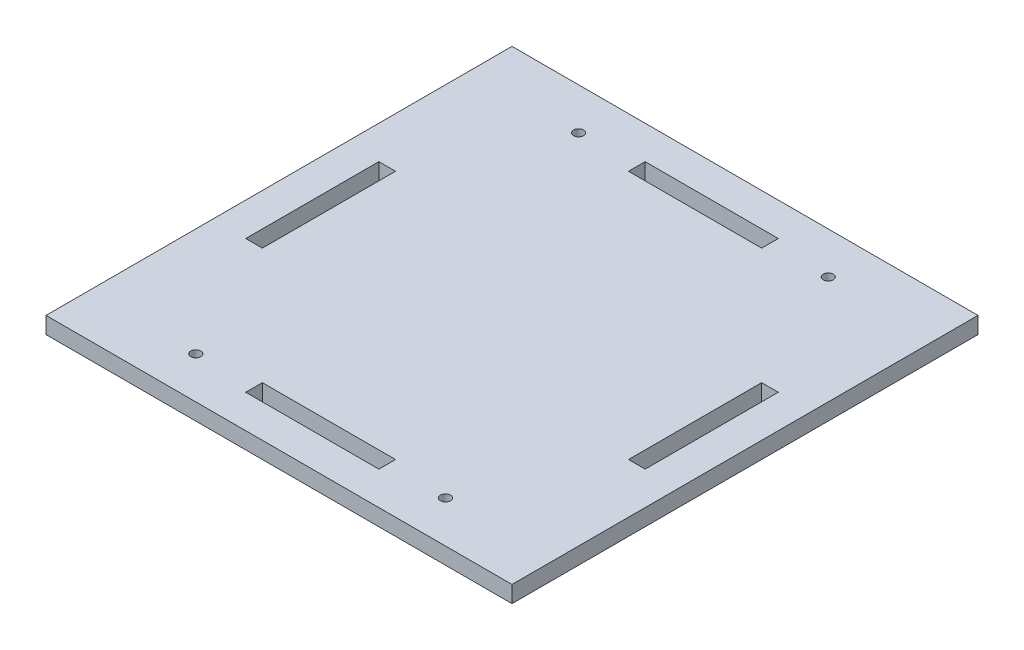
ISO-10303-21;
HEADER;
FILE_DESCRIPTION(('STEP AP214'),'2;1');
FILE_NAME('part.step','',(''),(''),'','','');
FILE_SCHEMA(('AUTOMOTIVE_DESIGN { 1 0 10303 214 1 1 1 1 }'));
ENDSEC;
DATA;
#1=APPLICATION_CONTEXT('core data for automotive mechanical design processes');
#2=APPLICATION_PROTOCOL_DEFINITION('international standard','automotive_design',2000,#1);
#3=PRODUCT_CONTEXT('',#1,'mechanical');
#4=PRODUCT('Part','Part','',(#3));
#5=PRODUCT_RELATED_PRODUCT_CATEGORY('part','',(#4));
#6=PRODUCT_DEFINITION_FORMATION('','',#4);
#7=PRODUCT_DEFINITION_CONTEXT('part definition',#1,'design');
#8=PRODUCT_DEFINITION('design','',#6,#7);
#9=PRODUCT_DEFINITION_SHAPE('','',#8);
#10=(LENGTH_UNIT() NAMED_UNIT(*) SI_UNIT(.MILLI.,.METRE.));
#11=(NAMED_UNIT(*) PLANE_ANGLE_UNIT() SI_UNIT($,.RADIAN.));
#12=(NAMED_UNIT(*) SI_UNIT($,.STERADIAN.) SOLID_ANGLE_UNIT());
#13=UNCERTAINTY_MEASURE_WITH_UNIT(LENGTH_MEASURE(1.E-05),#10,'distance_accuracy_value','');
#14=(GEOMETRIC_REPRESENTATION_CONTEXT(3) GLOBAL_UNCERTAINTY_ASSIGNED_CONTEXT((#13)) GLOBAL_UNIT_ASSIGNED_CONTEXT((#10,
#11,#12)) REPRESENTATION_CONTEXT('',''));
#15=CARTESIAN_POINT('',(0.,0.,0.));
#16=DIRECTION('',(0.,0.,1.));
#17=DIRECTION('',(1.,0.,0.));
#18=AXIS2_PLACEMENT_3D('',#15,#16,#17);
#19=CARTESIAN_POINT('',(0.,5.,0.));
#20=DIRECTION('',(0.,1.,0.));
#21=DIRECTION('',(0.,0.,1.));
#22=AXIS2_PLACEMENT_3D('',#19,#20,#21);
#23=PLANE('',#22);
#24=CARTESIAN_POINT('',(32.5,5.,-12.5));
#25=DIRECTION('',(0.,-1.,0.));
#26=DIRECTION('',(0.,0.,-1.));
#27=AXIS2_PLACEMENT_3D('',#24,#25,#26);
#28=CIRCLE('',#27,1.5);
#29=CARTESIAN_POINT('',(32.5,5.,-14.));
#30=VERTEX_POINT('',#29);
#31=EDGE_CURVE('E633',#30,#30,#28,.T.);
#32=ORIENTED_EDGE('',*,*,#31,.T.);
#33=EDGE_LOOP('',(#32));
#34=FACE_BOUND('',#33,.T.);
#35=DIRECTION('',(-1.,0.,0.));
#36=VECTOR('',#35,1.);
#37=CARTESIAN_POINT('',(130.,5.,-90.));
#38=LINE('',#37,#36);
#39=CARTESIAN_POINT('',(130.,5.,-90.));
#40=VERTEX_POINT('',#39);
#41=CARTESIAN_POINT('',(125.,5.,-90.));
#42=VERTEX_POINT('',#41);
#43=EDGE_CURVE('E338',#40,#42,#38,.T.);
#44=ORIENTED_EDGE('',*,*,#43,.F.);
#45=DIRECTION('',(0.,0.,-1.));
#46=VECTOR('',#45,1.);
#47=CARTESIAN_POINT('',(130.,5.,-50.));
#48=LINE('',#47,#46);
#49=CARTESIAN_POINT('',(130.,5.,-50.));
#50=VERTEX_POINT('',#49);
#51=EDGE_CURVE('E330',#50,#40,#48,.T.);
#52=ORIENTED_EDGE('',*,*,#51,.F.);
#53=DIRECTION('',(1.,0.,0.));
#54=VECTOR('',#53,1.);
#55=CARTESIAN_POINT('',(125.,5.,-50.));
#56=LINE('',#55,#54);
#57=CARTESIAN_POINT('',(125.,5.,-50.));
#58=VERTEX_POINT('',#57);
#59=EDGE_CURVE('E353',#58,#50,#56,.T.);
#60=ORIENTED_EDGE('',*,*,#59,.F.);
#61=DIRECTION('',(0.,0.,1.));
#62=VECTOR('',#61,1.);
#63=CARTESIAN_POINT('',(125.,5.,-90.));
#64=LINE('',#63,#62);
#65=EDGE_CURVE('E351',#42,#58,#64,.T.);
#66=ORIENTED_EDGE('',*,*,#65,.F.);
#67=EDGE_LOOP('',(#44,#52,#60,#66));
#68=FACE_BOUND('',#67,.T.);
#69=CARTESIAN_POINT('',(32.5,5.,-127.5));
#70=DIRECTION('',(0.,1.,0.));
#71=DIRECTION('',(0.,0.,1.));
#72=AXIS2_PLACEMENT_3D('',#69,#70,#71);
#73=CIRCLE('',#72,1.5);
#74=CARTESIAN_POINT('',(32.5,5.,-126.));
#75=VERTEX_POINT('',#74);
#76=EDGE_CURVE('E375',#75,#75,#73,.T.);
#77=ORIENTED_EDGE('',*,*,#76,.F.);
#78=EDGE_LOOP('',(#77));
#79=FACE_BOUND('',#78,.T.);
#80=DIRECTION('',(0.,0.,1.));
#81=VECTOR('',#80,1.);
#82=CARTESIAN_POINT('',(90.,5.,-130.));
#83=LINE('',#82,#81);
#84=CARTESIAN_POINT('',(90.,5.,-130.));
#85=VERTEX_POINT('',#84);
#86=CARTESIAN_POINT('',(90.,5.,-125.));
#87=VERTEX_POINT('',#86);
#88=EDGE_CURVE('E381',#85,#87,#83,.T.);
#89=ORIENTED_EDGE('',*,*,#88,.T.);
#90=DIRECTION('',(-1.,0.,0.));
#91=VECTOR('',#90,1.);
#92=CARTESIAN_POINT('',(90.,5.,-125.));
#93=LINE('',#92,#91);
#94=CARTESIAN_POINT('',(50.,5.,-125.));
#95=VERTEX_POINT('',#94);
#96=EDGE_CURVE('E384',#87,#95,#93,.T.);
#97=ORIENTED_EDGE('',*,*,#96,.T.);
#98=DIRECTION('',(0.,0.,-1.));
#99=VECTOR('',#98,1.);
#100=CARTESIAN_POINT('',(50.,5.,-125.));
#101=LINE('',#100,#99);
#102=CARTESIAN_POINT('',(50.,5.,-130.));
#103=VERTEX_POINT('',#102);
#104=EDGE_CURVE('E388',#95,#103,#101,.T.);
#105=ORIENTED_EDGE('',*,*,#104,.T.);
#106=DIRECTION('',(1.,0.,0.));
#107=VECTOR('',#106,1.);
#108=CARTESIAN_POINT('',(50.,5.,-130.));
#109=LINE('',#108,#107);
#110=EDGE_CURVE('E391',#103,#85,#109,.T.);
#111=ORIENTED_EDGE('',*,*,#110,.T.);
#112=EDGE_LOOP('',(#89,#97,#105,#111));
#113=FACE_BOUND('',#112,.T.);
#114=DIRECTION('',(1.,0.,0.));
#115=VECTOR('',#114,1.);
#116=CARTESIAN_POINT('',(10.,5.,-90.));
#117=LINE('',#116,#115);
#118=CARTESIAN_POINT('',(10.,5.,-90.));
#119=VERTEX_POINT('',#118);
#120=CARTESIAN_POINT('',(15.,5.,-90.));
#121=VERTEX_POINT('',#120);
#122=EDGE_CURVE('E444',#119,#121,#117,.T.);
#123=ORIENTED_EDGE('',*,*,#122,.T.);
#124=DIRECTION('',(0.,0.,1.));
#125=VECTOR('',#124,1.);
#126=CARTESIAN_POINT('',(15.,5.,-90.));
#127=LINE('',#126,#125);
#128=CARTESIAN_POINT('',(15.,5.,-50.));
#129=VERTEX_POINT('',#128);
#130=EDGE_CURVE('E447',#121,#129,#127,.T.);
#131=ORIENTED_EDGE('',*,*,#130,.T.);
#132=DIRECTION('',(-1.,0.,0.));
#133=VECTOR('',#132,1.);
#134=CARTESIAN_POINT('',(15.,5.,-50.));
#135=LINE('',#134,#133);
#136=CARTESIAN_POINT('',(10.,5.,-50.));
#137=VERTEX_POINT('',#136);
#138=EDGE_CURVE('E451',#129,#137,#135,.T.);
#139=ORIENTED_EDGE('',*,*,#138,.T.);
#140=DIRECTION('',(0.,0.,-1.));
#141=VECTOR('',#140,1.);
#142=CARTESIAN_POINT('',(10.,5.,-50.));
#143=LINE('',#142,#141);
#144=EDGE_CURVE('E454',#137,#119,#143,.T.);
#145=ORIENTED_EDGE('',*,*,#144,.T.);
#146=EDGE_LOOP('',(#123,#131,#139,#145));
#147=FACE_BOUND('',#146,.T.);
#148=DIRECTION('',(0.,0.,1.));
#149=VECTOR('',#148,1.);
#150=CARTESIAN_POINT('',(0.,5.,-140.));
#151=LINE('',#150,#149);
#152=CARTESIAN_POINT('',(0.,5.,-140.));
#153=VERTEX_POINT('',#152);
#154=CARTESIAN_POINT('',(0.,5.,0.));
#155=VERTEX_POINT('',#154);
#156=EDGE_CURVE('E476',#153,#155,#151,.T.);
#157=ORIENTED_EDGE('',*,*,#156,.T.);
#158=DIRECTION('',(1.,0.,0.));
#159=VECTOR('',#158,1.);
#160=CARTESIAN_POINT('',(0.,5.,0.));
#161=LINE('',#160,#159);
#162=CARTESIAN_POINT('',(140.,5.,0.));
#163=VERTEX_POINT('',#162);
#164=EDGE_CURVE('E479',#155,#163,#161,.T.);
#165=ORIENTED_EDGE('',*,*,#164,.T.);
#166=DIRECTION('',(0.,0.,-1.));
#167=VECTOR('',#166,1.);
#168=CARTESIAN_POINT('',(140.,5.,0.));
#169=LINE('',#168,#167);
#170=CARTESIAN_POINT('',(140.,5.,-140.));
#171=VERTEX_POINT('',#170);
#172=EDGE_CURVE('E482',#163,#171,#169,.T.);
#173=ORIENTED_EDGE('',*,*,#172,.T.);
#174=DIRECTION('',(-1.,0.,0.));
#175=VECTOR('',#174,1.);
#176=CARTESIAN_POINT('',(140.,5.,-140.));
#177=LINE('',#176,#175);
#178=EDGE_CURVE('E484',#171,#153,#177,.T.);
#179=ORIENTED_EDGE('',*,*,#178,.T.);
#180=EDGE_LOOP('',(#157,#165,#173,#179));
#181=FACE_BOUND('',#180,.T.);
#182=DIRECTION('',(-1.,0.,0.));
#183=VECTOR('',#182,1.);
#184=CARTESIAN_POINT('',(90.,5.,-15.));
#185=LINE('',#184,#183);
#186=CARTESIAN_POINT('',(90.,5.,-15.));
#187=VERTEX_POINT('',#186);
#188=CARTESIAN_POINT('',(50.,5.,-15.));
#189=VERTEX_POINT('',#188);
#190=EDGE_CURVE('E415',#187,#189,#185,.T.);
#191=ORIENTED_EDGE('',*,*,#190,.F.);
#192=DIRECTION('',(0.,0.,-1.));
#193=VECTOR('',#192,1.);
#194=CARTESIAN_POINT('',(90.,5.,-10.));
#195=LINE('',#194,#193);
#196=CARTESIAN_POINT('',(90.,5.,-10.));
#197=VERTEX_POINT('',#196);
#198=EDGE_CURVE('E413',#197,#187,#195,.T.);
#199=ORIENTED_EDGE('',*,*,#198,.F.);
#200=DIRECTION('',(1.,0.,0.));
#201=VECTOR('',#200,1.);
#202=CARTESIAN_POINT('',(50.,5.,-10.));
#203=LINE('',#202,#201);
#204=CARTESIAN_POINT('',(50.,5.,-10.));
#205=VERTEX_POINT('',#204);
#206=EDGE_CURVE('E421',#205,#197,#203,.T.);
#207=ORIENTED_EDGE('',*,*,#206,.F.);
#208=DIRECTION('',(0.,0.,1.));
#209=VECTOR('',#208,1.);
#210=CARTESIAN_POINT('',(50.,5.,-15.));
#211=LINE('',#210,#209);
#212=EDGE_CURVE('E418',#189,#205,#211,.T.);
#213=ORIENTED_EDGE('',*,*,#212,.F.);
#214=EDGE_LOOP('',(#191,#199,#207,#213));
#215=FACE_BOUND('',#214,.T.);
#216=CARTESIAN_POINT('',(107.5,5.,-127.5));
#217=DIRECTION('',(0.,-1.,0.));
#218=DIRECTION('',(0.,0.,-1.));
#219=AXIS2_PLACEMENT_3D('',#216,#217,#218);
#220=CIRCLE('',#219,1.5);
#221=CARTESIAN_POINT('',(107.5,5.,-129.));
#222=VERTEX_POINT('',#221);
#223=EDGE_CURVE('E369',#222,#222,#220,.T.);
#224=ORIENTED_EDGE('',*,*,#223,.T.);
#225=EDGE_LOOP('',(#224));
#226=FACE_BOUND('',#225,.T.);
#227=CARTESIAN_POINT('',(107.5,5.,-12.5));
#228=DIRECTION('',(0.,1.,0.));
#229=DIRECTION('',(0.,0.,1.));
#230=AXIS2_PLACEMENT_3D('',#227,#228,#229);
#231=CIRCLE('',#230,1.5);
#232=CARTESIAN_POINT('',(107.5,5.,-11.));
#233=VERTEX_POINT('',#232);
#234=EDGE_CURVE('E359',#233,#233,#231,.T.);
#235=ORIENTED_EDGE('',*,*,#234,.F.);
#236=EDGE_LOOP('',(#235));
#237=FACE_BOUND('',#236,.T.);
#238=ADVANCED_FACE('F193',(#34,#68,#79,#113,#147,#181,#215,#226,#237),#23,.T.);
#239=CARTESIAN_POINT('',(0.,0.,0.));
#240=DIRECTION('',(0.,1.,0.));
#241=DIRECTION('',(0.,0.,1.));
#242=AXIS2_PLACEMENT_3D('',#239,#240,#241);
#243=PLANE('',#242);
#244=CARTESIAN_POINT('',(32.5,0.,-12.5));
#245=DIRECTION('',(0.,-1.,0.));
#246=DIRECTION('',(0.,0.,-1.));
#247=AXIS2_PLACEMENT_3D('',#244,#245,#246);
#248=CIRCLE('',#247,1.5);
#249=CARTESIAN_POINT('',(32.5,0.,-14.));
#250=VERTEX_POINT('',#249);
#251=EDGE_CURVE('E636',#250,#250,#248,.T.);
#252=ORIENTED_EDGE('',*,*,#251,.F.);
#253=EDGE_LOOP('',(#252));
#254=FACE_BOUND('',#253,.T.);
#255=CARTESIAN_POINT('',(32.5,0.,-127.5));
#256=DIRECTION('',(0.,1.,0.));
#257=DIRECTION('',(0.,0.,1.));
#258=AXIS2_PLACEMENT_3D('',#255,#256,#257);
#259=CIRCLE('',#258,1.5);
#260=CARTESIAN_POINT('',(32.5,0.,-126.));
#261=VERTEX_POINT('',#260);
#262=EDGE_CURVE('E372',#261,#261,#259,.T.);
#263=ORIENTED_EDGE('',*,*,#262,.T.);
#264=EDGE_LOOP('',(#263));
#265=FACE_BOUND('',#264,.T.);
#266=DIRECTION('',(0.,0.,-1.));
#267=VECTOR('',#266,1.);
#268=CARTESIAN_POINT('',(90.,0.,-10.));
#269=LINE('',#268,#267);
#270=CARTESIAN_POINT('',(90.,0.,-10.));
#271=VERTEX_POINT('',#270);
#272=CARTESIAN_POINT('',(90.,0.,-15.));
#273=VERTEX_POINT('',#272);
#274=EDGE_CURVE('E406',#271,#273,#269,.T.);
#275=ORIENTED_EDGE('',*,*,#274,.T.);
#276=DIRECTION('',(-1.,0.,0.));
#277=VECTOR('',#276,1.);
#278=CARTESIAN_POINT('',(90.,0.,-15.));
#279=LINE('',#278,#277);
#280=CARTESIAN_POINT('',(50.,0.,-15.));
#281=VERTEX_POINT('',#280);
#282=EDGE_CURVE('E426',#273,#281,#279,.T.);
#283=ORIENTED_EDGE('',*,*,#282,.T.);
#284=DIRECTION('',(0.,0.,1.));
#285=VECTOR('',#284,1.);
#286=CARTESIAN_POINT('',(50.,0.,-15.));
#287=LINE('',#286,#285);
#288=CARTESIAN_POINT('',(50.,0.,-10.));
#289=VERTEX_POINT('',#288);
#290=EDGE_CURVE('E429',#281,#289,#287,.T.);
#291=ORIENTED_EDGE('',*,*,#290,.T.);
#292=DIRECTION('',(1.,0.,0.));
#293=VECTOR('',#292,1.);
#294=CARTESIAN_POINT('',(50.,0.,-10.));
#295=LINE('',#294,#293);
#296=EDGE_CURVE('E416',#289,#271,#295,.T.);
#297=ORIENTED_EDGE('',*,*,#296,.T.);
#298=EDGE_LOOP('',(#275,#283,#291,#297));
#299=FACE_BOUND('',#298,.T.);
#300=DIRECTION('',(0.,0.,1.));
#301=VECTOR('',#300,1.);
#302=CARTESIAN_POINT('',(15.,0.,-90.));
#303=LINE('',#302,#301);
#304=CARTESIAN_POINT('',(15.,0.,-90.));
#305=VERTEX_POINT('',#304);
#306=CARTESIAN_POINT('',(15.,0.,-50.));
#307=VERTEX_POINT('',#306);
#308=EDGE_CURVE('E459',#305,#307,#303,.T.);
#309=ORIENTED_EDGE('',*,*,#308,.F.);
#310=DIRECTION('',(1.,0.,0.));
#311=VECTOR('',#310,1.);
#312=CARTESIAN_POINT('',(10.,0.,-90.));
#313=LINE('',#312,#311);
#314=CARTESIAN_POINT('',(10.,0.,-90.));
#315=VERTEX_POINT('',#314);
#316=EDGE_CURVE('E443',#315,#305,#313,.T.);
#317=ORIENTED_EDGE('',*,*,#316,.F.);
#318=DIRECTION('',(0.,0.,-1.));
#319=VECTOR('',#318,1.);
#320=CARTESIAN_POINT('',(10.,0.,-50.));
#321=LINE('',#320,#319);
#322=CARTESIAN_POINT('',(10.,0.,-50.));
#323=VERTEX_POINT('',#322);
#324=EDGE_CURVE('E448',#323,#315,#321,.T.);
#325=ORIENTED_EDGE('',*,*,#324,.F.);
#326=DIRECTION('',(-1.,0.,0.));
#327=VECTOR('',#326,1.);
#328=CARTESIAN_POINT('',(15.,0.,-50.));
#329=LINE('',#328,#327);
#330=EDGE_CURVE('E462',#307,#323,#329,.T.);
#331=ORIENTED_EDGE('',*,*,#330,.F.);
#332=EDGE_LOOP('',(#309,#317,#325,#331));
#333=FACE_BOUND('',#332,.T.);
#334=DIRECTION('',(0.,0.,1.));
#335=VECTOR('',#334,1.);
#336=CARTESIAN_POINT('',(0.,0.,-140.));
#337=LINE('',#336,#335);
#338=CARTESIAN_POINT('',(0.,0.,-140.));
#339=VERTEX_POINT('',#338);
#340=CARTESIAN_POINT('',(0.,0.,0.));
#341=VERTEX_POINT('',#340);
#342=EDGE_CURVE('E469',#339,#341,#337,.T.);
#343=ORIENTED_EDGE('',*,*,#342,.F.);
#344=DIRECTION('',(-1.,0.,0.));
#345=VECTOR('',#344,1.);
#346=CARTESIAN_POINT('',(140.,0.,-140.));
#347=LINE('',#346,#345);
#348=CARTESIAN_POINT('',(140.,0.,-140.));
#349=VERTEX_POINT('',#348);
#350=EDGE_CURVE('E480',#349,#339,#347,.T.);
#351=ORIENTED_EDGE('',*,*,#350,.F.);
#352=DIRECTION('',(0.,0.,-1.));
#353=VECTOR('',#352,1.);
#354=CARTESIAN_POINT('',(140.,0.,0.));
#355=LINE('',#354,#353);
#356=CARTESIAN_POINT('',(140.,0.,0.));
#357=VERTEX_POINT('',#356);
#358=EDGE_CURVE('E491',#357,#349,#355,.T.);
#359=ORIENTED_EDGE('',*,*,#358,.F.);
#360=DIRECTION('',(1.,0.,0.));
#361=VECTOR('',#360,1.);
#362=CARTESIAN_POINT('',(0.,0.,0.));
#363=LINE('',#362,#361);
#364=EDGE_CURVE('E489',#341,#357,#363,.T.);
#365=ORIENTED_EDGE('',*,*,#364,.F.);
#366=EDGE_LOOP('',(#343,#351,#359,#365));
#367=FACE_BOUND('',#366,.T.);
#368=DIRECTION('',(-1.,0.,0.));
#369=VECTOR('',#368,1.);
#370=CARTESIAN_POINT('',(90.,0.,-125.));
#371=LINE('',#370,#369);
#372=CARTESIAN_POINT('',(90.,0.,-125.));
#373=VERTEX_POINT('',#372);
#374=CARTESIAN_POINT('',(50.,0.,-125.));
#375=VERTEX_POINT('',#374);
#376=EDGE_CURVE('E396',#373,#375,#371,.T.);
#377=ORIENTED_EDGE('',*,*,#376,.F.);
#378=DIRECTION('',(0.,0.,1.));
#379=VECTOR('',#378,1.);
#380=CARTESIAN_POINT('',(90.,0.,-130.));
#381=LINE('',#380,#379);
#382=CARTESIAN_POINT('',(90.,0.,-130.));
#383=VERTEX_POINT('',#382);
#384=EDGE_CURVE('E378',#383,#373,#381,.T.);
#385=ORIENTED_EDGE('',*,*,#384,.F.);
#386=DIRECTION('',(1.,0.,0.));
#387=VECTOR('',#386,1.);
#388=CARTESIAN_POINT('',(50.,0.,-130.));
#389=LINE('',#388,#387);
#390=CARTESIAN_POINT('',(50.,0.,-130.));
#391=VERTEX_POINT('',#390);
#392=EDGE_CURVE('E385',#391,#383,#389,.T.);
#393=ORIENTED_EDGE('',*,*,#392,.F.);
#394=DIRECTION('',(0.,0.,-1.));
#395=VECTOR('',#394,1.);
#396=CARTESIAN_POINT('',(50.,0.,-125.));
#397=LINE('',#396,#395);
#398=EDGE_CURVE('E399',#375,#391,#397,.T.);
#399=ORIENTED_EDGE('',*,*,#398,.F.);
#400=EDGE_LOOP('',(#377,#385,#393,#399));
#401=FACE_BOUND('',#400,.T.);
#402=CARTESIAN_POINT('',(107.5,0.,-127.5));
#403=DIRECTION('',(0.,-1.,0.));
#404=DIRECTION('',(0.,0.,-1.));
#405=AXIS2_PLACEMENT_3D('',#402,#403,#404);
#406=CIRCLE('',#405,1.5);
#407=CARTESIAN_POINT('',(107.5,0.,-129.));
#408=VERTEX_POINT('',#407);
#409=EDGE_CURVE('E346',#408,#408,#406,.T.);
#410=ORIENTED_EDGE('',*,*,#409,.F.);
#411=EDGE_LOOP('',(#410));
#412=FACE_BOUND('',#411,.T.);
#413=DIRECTION('',(0.,0.,-1.));
#414=VECTOR('',#413,1.);
#415=CARTESIAN_POINT('',(130.,0.,-50.));
#416=LINE('',#415,#414);
#417=CARTESIAN_POINT('',(130.,0.,-50.));
#418=VERTEX_POINT('',#417);
#419=CARTESIAN_POINT('',(130.,0.,-90.));
#420=VERTEX_POINT('',#419);
#421=EDGE_CURVE('E216',#418,#420,#416,.T.);
#422=ORIENTED_EDGE('',*,*,#421,.T.);
#423=DIRECTION('',(-1.,0.,0.));
#424=VECTOR('',#423,1.);
#425=CARTESIAN_POINT('',(130.,0.,-90.));
#426=LINE('',#425,#424);
#427=CARTESIAN_POINT('',(125.,0.,-90.));
#428=VERTEX_POINT('',#427);
#429=EDGE_CURVE('E345',#420,#428,#426,.T.);
#430=ORIENTED_EDGE('',*,*,#429,.T.);
#431=DIRECTION('',(0.,0.,1.));
#432=VECTOR('',#431,1.);
#433=CARTESIAN_POINT('',(125.,0.,-90.));
#434=LINE('',#433,#432);
#435=CARTESIAN_POINT('',(125.,0.,-50.));
#436=VERTEX_POINT('',#435);
#437=EDGE_CURVE('E361',#428,#436,#434,.T.);
#438=ORIENTED_EDGE('',*,*,#437,.T.);
#439=DIRECTION('',(1.,0.,0.));
#440=VECTOR('',#439,1.);
#441=CARTESIAN_POINT('',(125.,0.,-50.));
#442=LINE('',#441,#440);
#443=EDGE_CURVE('E339',#436,#418,#442,.T.);
#444=ORIENTED_EDGE('',*,*,#443,.T.);
#445=EDGE_LOOP('',(#422,#430,#438,#444));
#446=FACE_BOUND('',#445,.T.);
#447=CARTESIAN_POINT('',(107.5,0.,-12.5));
#448=DIRECTION('',(0.,1.,0.));
#449=DIRECTION('',(0.,0.,1.));
#450=AXIS2_PLACEMENT_3D('',#447,#448,#449);
#451=CIRCLE('',#450,1.5);
#452=CARTESIAN_POINT('',(107.5,0.,-11.));
#453=VERTEX_POINT('',#452);
#454=EDGE_CURVE('E638',#453,#453,#451,.T.);
#455=ORIENTED_EDGE('',*,*,#454,.T.);
#456=EDGE_LOOP('',(#455));
#457=FACE_BOUND('',#456,.T.);
#458=ADVANCED_FACE('F509',(#254,#265,#299,#333,#367,#401,#412,#446,#457),#243,.F.);
#459=CARTESIAN_POINT('',(0.,5.,-140.));
#460=DIRECTION('',(1.,0.,0.));
#461=DIRECTION('',(0.,0.,-1.));
#462=AXIS2_PLACEMENT_3D('',#459,#460,#461);
#463=PLANE('',#462);
#464=ORIENTED_EDGE('',*,*,#342,.T.);
#465=DIRECTION('',(0.,-1.,0.));
#466=VECTOR('',#465,1.);
#467=CARTESIAN_POINT('',(0.,5.,0.));
#468=LINE('',#467,#466);
#469=EDGE_CURVE('E12',#155,#341,#468,.T.);
#470=ORIENTED_EDGE('',*,*,#469,.F.);
#471=ORIENTED_EDGE('',*,*,#156,.F.);
#472=DIRECTION('',(0.,-1.,0.));
#473=VECTOR('',#472,1.);
#474=CARTESIAN_POINT('',(0.,5.,-140.));
#475=LINE('',#474,#473);
#476=EDGE_CURVE('E486',#153,#339,#475,.T.);
#477=ORIENTED_EDGE('',*,*,#476,.T.);
#478=EDGE_LOOP('',(#464,#470,#471,#477));
#479=FACE_BOUND('',#478,.T.);
#480=ADVANCED_FACE('F195',(#479),#463,.F.);
#481=CARTESIAN_POINT('',(0.,5.,0.));
#482=DIRECTION('',(0.,0.,-1.));
#483=DIRECTION('',(-1.,0.,0.));
#484=AXIS2_PLACEMENT_3D('',#481,#482,#483);
#485=PLANE('',#484);
#486=ORIENTED_EDGE('',*,*,#364,.T.);
#487=DIRECTION('',(0.,-1.,0.));
#488=VECTOR('',#487,1.);
#489=CARTESIAN_POINT('',(140.,5.,0.));
#490=LINE('',#489,#488);
#491=EDGE_CURVE('E201',#163,#357,#490,.T.);
#492=ORIENTED_EDGE('',*,*,#491,.F.);
#493=ORIENTED_EDGE('',*,*,#164,.F.);
#494=ORIENTED_EDGE('',*,*,#469,.T.);
#495=EDGE_LOOP('',(#486,#492,#493,#494));
#496=FACE_BOUND('',#495,.T.);
#497=ADVANCED_FACE('F520',(#496),#485,.F.);
#498=CARTESIAN_POINT('',(140.,5.,0.));
#499=DIRECTION('',(-1.,0.,0.));
#500=DIRECTION('',(0.,0.,1.));
#501=AXIS2_PLACEMENT_3D('',#498,#499,#500);
#502=PLANE('',#501);
#503=ORIENTED_EDGE('',*,*,#358,.T.);
#504=DIRECTION('',(0.,-1.,0.));
#505=VECTOR('',#504,1.);
#506=CARTESIAN_POINT('',(140.,5.,-140.));
#507=LINE('',#506,#505);
#508=EDGE_CURVE('E496',#171,#349,#507,.T.);
#509=ORIENTED_EDGE('',*,*,#508,.F.);
#510=ORIENTED_EDGE('',*,*,#172,.F.);
#511=ORIENTED_EDGE('',*,*,#491,.T.);
#512=EDGE_LOOP('',(#503,#509,#510,#511));
#513=FACE_BOUND('',#512,.T.);
#514=ADVANCED_FACE('F503',(#513),#502,.F.);
#515=CARTESIAN_POINT('',(140.,5.,-140.));
#516=DIRECTION('',(0.,0.,1.));
#517=DIRECTION('',(1.,0.,0.));
#518=AXIS2_PLACEMENT_3D('',#515,#516,#517);
#519=PLANE('',#518);
#520=ORIENTED_EDGE('',*,*,#350,.T.);
#521=ORIENTED_EDGE('',*,*,#476,.F.);
#522=ORIENTED_EDGE('',*,*,#178,.F.);
#523=ORIENTED_EDGE('',*,*,#508,.T.);
#524=EDGE_LOOP('',(#520,#521,#522,#523));
#525=FACE_BOUND('',#524,.T.);
#526=ADVANCED_FACE('F513',(#525),#519,.F.);
#527=CARTESIAN_POINT('',(10.,5.,-90.));
#528=DIRECTION('',(0.,0.,-1.));
#529=DIRECTION('',(-1.,0.,0.));
#530=AXIS2_PLACEMENT_3D('',#527,#528,#529);
#531=PLANE('',#530);
#532=ORIENTED_EDGE('',*,*,#316,.T.);
#533=DIRECTION('',(0.,-1.,0.));
#534=VECTOR('',#533,1.);
#535=CARTESIAN_POINT('',(15.,5.,-90.));
#536=LINE('',#535,#534);
#537=EDGE_CURVE('E457',#121,#305,#536,.T.);
#538=ORIENTED_EDGE('',*,*,#537,.F.);
#539=ORIENTED_EDGE('',*,*,#122,.F.);
#540=DIRECTION('',(0.,-1.,0.));
#541=VECTOR('',#540,1.);
#542=CARTESIAN_POINT('',(10.,5.,-90.));
#543=LINE('',#542,#541);
#544=EDGE_CURVE('E467',#119,#315,#543,.T.);
#545=ORIENTED_EDGE('',*,*,#544,.T.);
#546=EDGE_LOOP('',(#532,#538,#539,#545));
#547=FACE_BOUND('',#546,.T.);
#548=ADVANCED_FACE('F537',(#547),#531,.F.);
#549=CARTESIAN_POINT('',(10.,5.,-50.));
#550=DIRECTION('',(-1.,0.,0.));
#551=DIRECTION('',(0.,0.,1.));
#552=AXIS2_PLACEMENT_3D('',#549,#550,#551);
#553=PLANE('',#552);
#554=ORIENTED_EDGE('',*,*,#324,.T.);
#555=ORIENTED_EDGE('',*,*,#544,.F.);
#556=ORIENTED_EDGE('',*,*,#144,.F.);
#557=DIRECTION('',(0.,-1.,0.));
#558=VECTOR('',#557,1.);
#559=CARTESIAN_POINT('',(10.,5.,-50.));
#560=LINE('',#559,#558);
#561=EDGE_CURVE('E470',#137,#323,#560,.T.);
#562=ORIENTED_EDGE('',*,*,#561,.T.);
#563=EDGE_LOOP('',(#554,#555,#556,#562));
#564=FACE_BOUND('',#563,.T.);
#565=ADVANCED_FACE('F544',(#564),#553,.F.);
#566=CARTESIAN_POINT('',(15.,5.,-50.));
#567=DIRECTION('',(0.,0.,1.));
#568=DIRECTION('',(1.,0.,0.));
#569=AXIS2_PLACEMENT_3D('',#566,#567,#568);
#570=PLANE('',#569);
#571=ORIENTED_EDGE('',*,*,#330,.T.);
#572=ORIENTED_EDGE('',*,*,#561,.F.);
#573=ORIENTED_EDGE('',*,*,#138,.F.);
#574=DIRECTION('',(0.,-1.,0.));
#575=VECTOR('',#574,1.);
#576=CARTESIAN_POINT('',(15.,5.,-50.));
#577=LINE('',#576,#575);
#578=EDGE_CURVE('E472',#129,#307,#577,.T.);
#579=ORIENTED_EDGE('',*,*,#578,.T.);
#580=EDGE_LOOP('',(#571,#572,#573,#579));
#581=FACE_BOUND('',#580,.T.);
#582=ADVANCED_FACE('F549',(#581),#570,.F.);
#583=CARTESIAN_POINT('',(15.,5.,-90.));
#584=DIRECTION('',(1.,0.,0.));
#585=DIRECTION('',(0.,0.,-1.));
#586=AXIS2_PLACEMENT_3D('',#583,#584,#585);
#587=PLANE('',#586);
#588=ORIENTED_EDGE('',*,*,#308,.T.);
#589=ORIENTED_EDGE('',*,*,#578,.F.);
#590=ORIENTED_EDGE('',*,*,#130,.F.);
#591=ORIENTED_EDGE('',*,*,#537,.T.);
#592=EDGE_LOOP('',(#588,#589,#590,#591));
#593=FACE_BOUND('',#592,.T.);
#594=ADVANCED_FACE('F559',(#593),#587,.F.);
#595=CARTESIAN_POINT('',(90.,5.,-10.));
#596=DIRECTION('',(-1.,0.,0.));
#597=DIRECTION('',(0.,0.,1.));
#598=AXIS2_PLACEMENT_3D('',#595,#596,#597);
#599=PLANE('',#598);
#600=ORIENTED_EDGE('',*,*,#274,.F.);
#601=DIRECTION('',(0.,-1.,0.));
#602=VECTOR('',#601,1.);
#603=CARTESIAN_POINT('',(90.,5.,-10.));
#604=LINE('',#603,#602);
#605=EDGE_CURVE('E423',#197,#271,#604,.T.);
#606=ORIENTED_EDGE('',*,*,#605,.F.);
#607=ORIENTED_EDGE('',*,*,#198,.T.);
#608=DIRECTION('',(0.,-1.,0.));
#609=VECTOR('',#608,1.);
#610=CARTESIAN_POINT('',(90.,5.,-15.));
#611=LINE('',#610,#609);
#612=EDGE_CURVE('E440',#187,#273,#611,.T.);
#613=ORIENTED_EDGE('',*,*,#612,.T.);
#614=EDGE_LOOP('',(#600,#606,#607,#613));
#615=FACE_BOUND('',#614,.T.);
#616=ADVANCED_FACE('F570',(#615),#599,.T.);
#617=CARTESIAN_POINT('',(90.,5.,-15.));
#618=DIRECTION('',(0.,0.,1.));
#619=DIRECTION('',(1.,0.,0.));
#620=AXIS2_PLACEMENT_3D('',#617,#618,#619);
#621=PLANE('',#620);
#622=ORIENTED_EDGE('',*,*,#282,.F.);
#623=ORIENTED_EDGE('',*,*,#612,.F.);
#624=ORIENTED_EDGE('',*,*,#190,.T.);
#625=DIRECTION('',(0.,-1.,0.));
#626=VECTOR('',#625,1.);
#627=CARTESIAN_POINT('',(50.,5.,-15.));
#628=LINE('',#627,#626);
#629=EDGE_CURVE('E438',#189,#281,#628,.T.);
#630=ORIENTED_EDGE('',*,*,#629,.T.);
#631=EDGE_LOOP('',(#622,#623,#624,#630));
#632=FACE_BOUND('',#631,.T.);
#633=ADVANCED_FACE('F574',(#632),#621,.T.);
#634=CARTESIAN_POINT('',(50.,5.,-15.));
#635=DIRECTION('',(1.,0.,0.));
#636=DIRECTION('',(0.,0.,-1.));
#637=AXIS2_PLACEMENT_3D('',#634,#635,#636);
#638=PLANE('',#637);
#639=ORIENTED_EDGE('',*,*,#290,.F.);
#640=ORIENTED_EDGE('',*,*,#629,.F.);
#641=ORIENTED_EDGE('',*,*,#212,.T.);
#642=DIRECTION('',(0.,-1.,0.));
#643=VECTOR('',#642,1.);
#644=CARTESIAN_POINT('',(50.,5.,-10.));
#645=LINE('',#644,#643);
#646=EDGE_CURVE('E436',#205,#289,#645,.T.);
#647=ORIENTED_EDGE('',*,*,#646,.T.);
#648=EDGE_LOOP('',(#639,#640,#641,#647));
#649=FACE_BOUND('',#648,.T.);
#650=ADVANCED_FACE('F578',(#649),#638,.T.);
#651=CARTESIAN_POINT('',(50.,5.,-10.));
#652=DIRECTION('',(0.,0.,-1.));
#653=DIRECTION('',(-1.,0.,0.));
#654=AXIS2_PLACEMENT_3D('',#651,#652,#653);
#655=PLANE('',#654);
#656=ORIENTED_EDGE('',*,*,#296,.F.);
#657=ORIENTED_EDGE('',*,*,#646,.F.);
#658=ORIENTED_EDGE('',*,*,#206,.T.);
#659=ORIENTED_EDGE('',*,*,#605,.T.);
#660=EDGE_LOOP('',(#656,#657,#658,#659));
#661=FACE_BOUND('',#660,.T.);
#662=ADVANCED_FACE('F582',(#661),#655,.T.);
#663=CARTESIAN_POINT('',(90.,5.,-130.));
#664=DIRECTION('',(1.,0.,0.));
#665=DIRECTION('',(0.,0.,-1.));
#666=AXIS2_PLACEMENT_3D('',#663,#664,#665);
#667=PLANE('',#666);
#668=ORIENTED_EDGE('',*,*,#384,.T.);
#669=DIRECTION('',(0.,-1.,0.));
#670=VECTOR('',#669,1.);
#671=CARTESIAN_POINT('',(90.,5.,-125.));
#672=LINE('',#671,#670);
#673=EDGE_CURVE('E394',#87,#373,#672,.T.);
#674=ORIENTED_EDGE('',*,*,#673,.F.);
#675=ORIENTED_EDGE('',*,*,#88,.F.);
#676=DIRECTION('',(0.,-1.,0.));
#677=VECTOR('',#676,1.);
#678=CARTESIAN_POINT('',(90.,5.,-130.));
#679=LINE('',#678,#677);
#680=EDGE_CURVE('E404',#85,#383,#679,.T.);
#681=ORIENTED_EDGE('',*,*,#680,.T.);
#682=EDGE_LOOP('',(#668,#674,#675,#681));
#683=FACE_BOUND('',#682,.T.);
#684=ADVANCED_FACE('F586',(#683),#667,.F.);
#685=CARTESIAN_POINT('',(50.,5.,-130.));
#686=DIRECTION('',(0.,0.,-1.));
#687=DIRECTION('',(-1.,0.,0.));
#688=AXIS2_PLACEMENT_3D('',#685,#686,#687);
#689=PLANE('',#688);
#690=ORIENTED_EDGE('',*,*,#392,.T.);
#691=ORIENTED_EDGE('',*,*,#680,.F.);
#692=ORIENTED_EDGE('',*,*,#110,.F.);
#693=DIRECTION('',(0.,-1.,0.));
#694=VECTOR('',#693,1.);
#695=CARTESIAN_POINT('',(50.,5.,-130.));
#696=LINE('',#695,#694);
#697=EDGE_CURVE('E407',#103,#391,#696,.T.);
#698=ORIENTED_EDGE('',*,*,#697,.T.);
#699=EDGE_LOOP('',(#690,#691,#692,#698));
#700=FACE_BOUND('',#699,.T.);
#701=ADVANCED_FACE('F590',(#700),#689,.F.);
#702=CARTESIAN_POINT('',(50.,5.,-125.));
#703=DIRECTION('',(-1.,0.,0.));
#704=DIRECTION('',(0.,0.,1.));
#705=AXIS2_PLACEMENT_3D('',#702,#703,#704);
#706=PLANE('',#705);
#707=ORIENTED_EDGE('',*,*,#398,.T.);
#708=ORIENTED_EDGE('',*,*,#697,.F.);
#709=ORIENTED_EDGE('',*,*,#104,.F.);
#710=DIRECTION('',(0.,-1.,0.));
#711=VECTOR('',#710,1.);
#712=CARTESIAN_POINT('',(50.,5.,-125.));
#713=LINE('',#712,#711);
#714=EDGE_CURVE('E409',#95,#375,#713,.T.);
#715=ORIENTED_EDGE('',*,*,#714,.T.);
#716=EDGE_LOOP('',(#707,#708,#709,#715));
#717=FACE_BOUND('',#716,.T.);
#718=ADVANCED_FACE('F596',(#717),#706,.F.);
#719=CARTESIAN_POINT('',(90.,5.,-125.));
#720=DIRECTION('',(0.,0.,1.));
#721=DIRECTION('',(1.,0.,0.));
#722=AXIS2_PLACEMENT_3D('',#719,#720,#721);
#723=PLANE('',#722);
#724=ORIENTED_EDGE('',*,*,#376,.T.);
#725=ORIENTED_EDGE('',*,*,#714,.F.);
#726=ORIENTED_EDGE('',*,*,#96,.F.);
#727=ORIENTED_EDGE('',*,*,#673,.T.);
#728=EDGE_LOOP('',(#724,#725,#726,#727));
#729=FACE_BOUND('',#728,.T.);
#730=ADVANCED_FACE('F592',(#729),#723,.F.);
#731=CARTESIAN_POINT('',(32.5,5.,-127.5));
#732=DIRECTION('',(0.,-1.,0.));
#733=DIRECTION('',(0.,0.,-1.));
#734=AXIS2_PLACEMENT_3D('',#731,#732,#733);
#735=CYLINDRICAL_SURFACE('',#734,1.5);
#736=ORIENTED_EDGE('',*,*,#76,.T.);
#737=EDGE_LOOP('',(#736));
#738=FACE_BOUND('',#737,.T.);
#739=ORIENTED_EDGE('',*,*,#262,.F.);
#740=EDGE_LOOP('',(#739));
#741=FACE_BOUND('',#740,.T.);
#742=ADVANCED_FACE('F595',(#738,#741),#735,.F.);
#743=CARTESIAN_POINT('',(107.5,5.,-127.5));
#744=DIRECTION('',(0.,-1.,0.));
#745=DIRECTION('',(0.,0.,-1.));
#746=AXIS2_PLACEMENT_3D('',#743,#744,#745);
#747=CYLINDRICAL_SURFACE('',#746,1.5);
#748=ORIENTED_EDGE('',*,*,#223,.F.);
#749=EDGE_LOOP('',(#748));
#750=FACE_BOUND('',#749,.T.);
#751=ORIENTED_EDGE('',*,*,#409,.T.);
#752=EDGE_LOOP('',(#751));
#753=FACE_BOUND('',#752,.T.);
#754=ADVANCED_FACE('F606',(#750,#753),#747,.F.);
#755=CARTESIAN_POINT('',(130.,5.,-50.));
#756=DIRECTION('',(-1.,0.,0.));
#757=DIRECTION('',(0.,0.,1.));
#758=AXIS2_PLACEMENT_3D('',#755,#756,#757);
#759=PLANE('',#758);
#760=ORIENTED_EDGE('',*,*,#421,.F.);
#761=DIRECTION('',(0.,-1.,0.));
#762=VECTOR('',#761,1.);
#763=CARTESIAN_POINT('',(130.,5.,-50.));
#764=LINE('',#763,#762);
#765=EDGE_CURVE('E334',#50,#418,#764,.T.);
#766=ORIENTED_EDGE('',*,*,#765,.F.);
#767=ORIENTED_EDGE('',*,*,#51,.T.);
#768=DIRECTION('',(0.,-1.,0.));
#769=VECTOR('',#768,1.);
#770=CARTESIAN_POINT('',(130.,5.,-90.));
#771=LINE('',#770,#769);
#772=EDGE_CURVE('E333',#40,#420,#771,.T.);
#773=ORIENTED_EDGE('',*,*,#772,.T.);
#774=EDGE_LOOP('',(#760,#766,#767,#773));
#775=FACE_BOUND('',#774,.T.);
#776=ADVANCED_FACE('F332',(#775),#759,.T.);
#777=CARTESIAN_POINT('',(130.,5.,-90.));
#778=DIRECTION('',(0.,0.,1.));
#779=DIRECTION('',(1.,0.,0.));
#780=AXIS2_PLACEMENT_3D('',#777,#778,#779);
#781=PLANE('',#780);
#782=ORIENTED_EDGE('',*,*,#429,.F.);
#783=ORIENTED_EDGE('',*,*,#772,.F.);
#784=ORIENTED_EDGE('',*,*,#43,.T.);
#785=DIRECTION('',(0.,-1.,0.));
#786=VECTOR('',#785,1.);
#787=CARTESIAN_POINT('',(125.,5.,-90.));
#788=LINE('',#787,#786);
#789=EDGE_CURVE('E347',#42,#428,#788,.T.);
#790=ORIENTED_EDGE('',*,*,#789,.T.);
#791=EDGE_LOOP('',(#782,#783,#784,#790));
#792=FACE_BOUND('',#791,.T.);
#793=ADVANCED_FACE('F342',(#792),#781,.T.);
#794=CARTESIAN_POINT('',(125.,5.,-90.));
#795=DIRECTION('',(1.,0.,0.));
#796=DIRECTION('',(0.,0.,-1.));
#797=AXIS2_PLACEMENT_3D('',#794,#795,#796);
#798=PLANE('',#797);
#799=ORIENTED_EDGE('',*,*,#437,.F.);
#800=ORIENTED_EDGE('',*,*,#789,.F.);
#801=ORIENTED_EDGE('',*,*,#65,.T.);
#802=DIRECTION('',(0.,-1.,0.));
#803=VECTOR('',#802,1.);
#804=CARTESIAN_POINT('',(125.,5.,-50.));
#805=LINE('',#804,#803);
#806=EDGE_CURVE('E208',#58,#436,#805,.T.);
#807=ORIENTED_EDGE('',*,*,#806,.T.);
#808=EDGE_LOOP('',(#799,#800,#801,#807));
#809=FACE_BOUND('',#808,.T.);
#810=ADVANCED_FACE('F615',(#809),#798,.T.);
#811=CARTESIAN_POINT('',(125.,5.,-50.));
#812=DIRECTION('',(0.,0.,-1.));
#813=DIRECTION('',(-1.,0.,0.));
#814=AXIS2_PLACEMENT_3D('',#811,#812,#813);
#815=PLANE('',#814);
#816=ORIENTED_EDGE('',*,*,#443,.F.);
#817=ORIENTED_EDGE('',*,*,#806,.F.);
#818=ORIENTED_EDGE('',*,*,#59,.T.);
#819=ORIENTED_EDGE('',*,*,#765,.T.);
#820=EDGE_LOOP('',(#816,#817,#818,#819));
#821=FACE_BOUND('',#820,.T.);
#822=ADVANCED_FACE('F618',(#821),#815,.T.);
#823=CARTESIAN_POINT('',(107.5,5.,-12.5));
#824=DIRECTION('',(0.,-1.,0.));
#825=DIRECTION('',(0.,0.,-1.));
#826=AXIS2_PLACEMENT_3D('',#823,#824,#825);
#827=CYLINDRICAL_SURFACE('',#826,1.5);
#828=ORIENTED_EDGE('',*,*,#234,.T.);
#829=EDGE_LOOP('',(#828));
#830=FACE_BOUND('',#829,.T.);
#831=ORIENTED_EDGE('',*,*,#454,.F.);
#832=EDGE_LOOP('',(#831));
#833=FACE_BOUND('',#832,.T.);
#834=ADVANCED_FACE('F622',(#830,#833),#827,.F.);
#835=CARTESIAN_POINT('',(32.5,5.,-12.5));
#836=DIRECTION('',(0.,-1.,0.));
#837=DIRECTION('',(0.,0.,-1.));
#838=AXIS2_PLACEMENT_3D('',#835,#836,#837);
#839=CYLINDRICAL_SURFACE('',#838,1.5);
#840=ORIENTED_EDGE('',*,*,#31,.F.);
#841=EDGE_LOOP('',(#840));
#842=FACE_BOUND('',#841,.T.);
#843=ORIENTED_EDGE('',*,*,#251,.T.);
#844=EDGE_LOOP('',(#843));
#845=FACE_BOUND('',#844,.T.);
#846=ADVANCED_FACE('F625',(#842,#845),#839,.F.);
#847=CLOSED_SHELL('',(#238,#458,#480,#497,#514,#526,#548,#565,#582,#594,#616,#633,#650,#662,
#684,#701,#718,#730,#742,#754,#776,#793,#810,#822,#834,#846));
#848=MANIFOLD_SOLID_BREP('B2',#847);
#849=ADVANCED_BREP_SHAPE_REPRESENTATION('',(#18,#848),#14);
#850=SHAPE_DEFINITION_REPRESENTATION(#9,#849);
ENDSEC;
END-ISO-10303-21;
